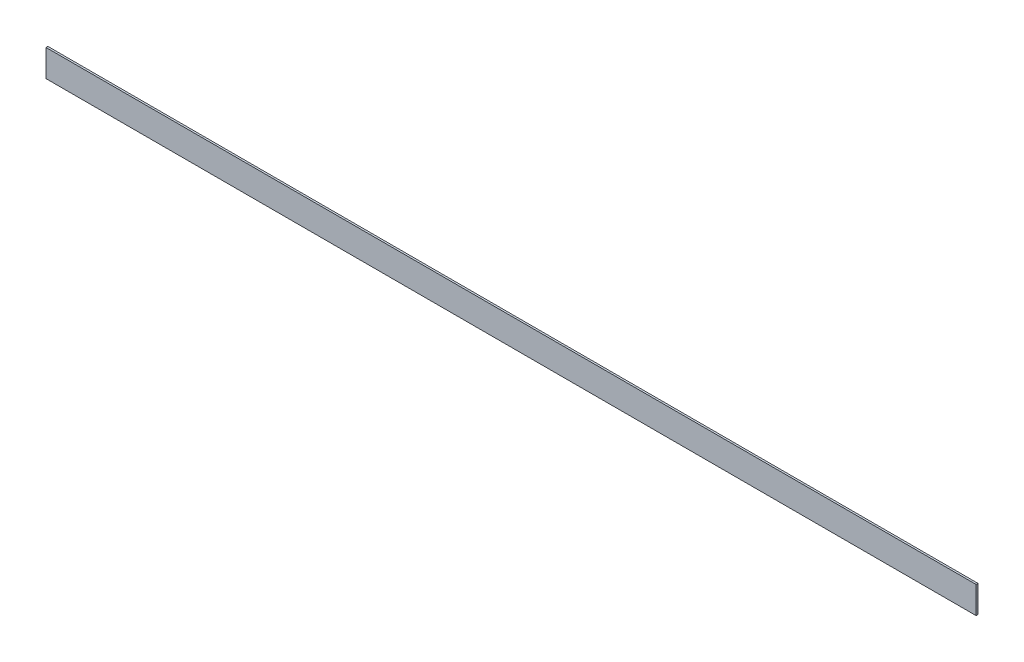
ISO-10303-21;
HEADER;
FILE_DESCRIPTION(('STEP AP214'),'2;1');
FILE_NAME('part.step','',(''),(''),'','','');
FILE_SCHEMA(('AUTOMOTIVE_DESIGN { 1 0 10303 214 1 1 1 1 }'));
ENDSEC;
DATA;
#1=APPLICATION_CONTEXT('core data for automotive mechanical design processes');
#2=APPLICATION_PROTOCOL_DEFINITION('international standard','automotive_design',2000,#1);
#3=PRODUCT_CONTEXT('',#1,'mechanical');
#4=PRODUCT('Part','Part','',(#3));
#5=PRODUCT_RELATED_PRODUCT_CATEGORY('part','',(#4));
#6=PRODUCT_DEFINITION_FORMATION('','',#4);
#7=PRODUCT_DEFINITION_CONTEXT('part definition',#1,'design');
#8=PRODUCT_DEFINITION('design','',#6,#7);
#9=PRODUCT_DEFINITION_SHAPE('','',#8);
#10=(LENGTH_UNIT() NAMED_UNIT(*) SI_UNIT(.MILLI.,.METRE.));
#11=(NAMED_UNIT(*) PLANE_ANGLE_UNIT() SI_UNIT($,.RADIAN.));
#12=(NAMED_UNIT(*) SI_UNIT($,.STERADIAN.) SOLID_ANGLE_UNIT());
#13=UNCERTAINTY_MEASURE_WITH_UNIT(LENGTH_MEASURE(1.E-05),#10,'distance_accuracy_value','');
#14=(GEOMETRIC_REPRESENTATION_CONTEXT(3) GLOBAL_UNCERTAINTY_ASSIGNED_CONTEXT((#13)) GLOBAL_UNIT_ASSIGNED_CONTEXT((#10,
#11,#12)) REPRESENTATION_CONTEXT('',''));
#15=CARTESIAN_POINT('',(0.,0.,0.));
#16=DIRECTION('',(0.,0.,1.));
#17=DIRECTION('',(1.,0.,0.));
#18=AXIS2_PLACEMENT_3D('',#15,#16,#17);
#19=CARTESIAN_POINT('',(-155.,9.,-0.314999999999981));
#20=DIRECTION('',(1.,0.,0.));
#21=DIRECTION('',(0.,0.,-1.));
#22=AXIS2_PLACEMENT_3D('',#19,#20,#21);
#23=PLANE('',#22);
#24=DIRECTION('',(0.,0.,1.));
#25=VECTOR('',#24,1.);
#26=CARTESIAN_POINT('',(-155.,0.,-0.314999999999981));
#27=LINE('',#26,#25);
#28=CARTESIAN_POINT('',(-155.,0.,-0.314999999999981));
#29=VERTEX_POINT('',#28);
#30=CARTESIAN_POINT('',(-155.,0.,0.315000000000019));
#31=VERTEX_POINT('',#30);
#32=EDGE_CURVE('E95',#29,#31,#27,.T.);
#33=ORIENTED_EDGE('',*,*,#32,.T.);
#34=DIRECTION('',(0.,-1.,0.));
#35=VECTOR('',#34,1.);
#36=CARTESIAN_POINT('',(-155.,9.,0.315000000000019));
#37=LINE('',#36,#35);
#38=CARTESIAN_POINT('',(-155.,9.,0.315000000000019));
#39=VERTEX_POINT('',#38);
#40=EDGE_CURVE('E11',#39,#31,#37,.T.);
#41=ORIENTED_EDGE('',*,*,#40,.F.);
#42=DIRECTION('',(0.,0.,1.));
#43=VECTOR('',#42,1.);
#44=CARTESIAN_POINT('',(-155.,9.,-0.314999999999981));
#45=LINE('',#44,#43);
#46=CARTESIAN_POINT('',(-155.,9.,-0.314999999999981));
#47=VERTEX_POINT('',#46);
#48=EDGE_CURVE('E83',#47,#39,#45,.T.);
#49=ORIENTED_EDGE('',*,*,#48,.F.);
#50=DIRECTION('',(0.,-1.,0.));
#51=VECTOR('',#50,1.);
#52=CARTESIAN_POINT('',(-155.,9.,-0.314999999999981));
#53=LINE('',#52,#51);
#54=EDGE_CURVE('E91',#47,#29,#53,.T.);
#55=ORIENTED_EDGE('',*,*,#54,.T.);
#56=EDGE_LOOP('',(#33,#41,#49,#55));
#57=FACE_BOUND('',#56,.T.);
#58=ADVANCED_FACE('F32',(#57),#23,.F.);
#59=CARTESIAN_POINT('',(155.,9.,0.314999999999981));
#60=DIRECTION('',(0.,0.,-1.));
#61=DIRECTION('',(-1.,0.,0.));
#62=AXIS2_PLACEMENT_3D('',#59,#60,#61);
#63=PLANE('',#62);
#64=DIRECTION('',(1.,0.,0.));
#65=VECTOR('',#64,1.);
#66=CARTESIAN_POINT('',(155.,0.,0.314999999999981));
#67=LINE('',#66,#65);
#68=CARTESIAN_POINT('',(155.,0.,0.314999999999981));
#69=VERTEX_POINT('',#68);
#70=EDGE_CURVE('E87',#31,#69,#67,.T.);
#71=ORIENTED_EDGE('',*,*,#70,.T.);
#72=DIRECTION('',(0.,-1.,0.));
#73=VECTOR('',#72,1.);
#74=CARTESIAN_POINT('',(155.,9.,0.314999999999981));
#75=LINE('',#74,#73);
#76=CARTESIAN_POINT('',(155.,9.,0.314999999999981));
#77=VERTEX_POINT('',#76);
#78=EDGE_CURVE('E40',#77,#69,#75,.T.);
#79=ORIENTED_EDGE('',*,*,#78,.F.);
#80=DIRECTION('',(1.,0.,0.));
#81=VECTOR('',#80,1.);
#82=CARTESIAN_POINT('',(155.,9.,0.314999999999981));
#83=LINE('',#82,#81);
#84=EDGE_CURVE('E78',#39,#77,#83,.T.);
#85=ORIENTED_EDGE('',*,*,#84,.F.);
#86=ORIENTED_EDGE('',*,*,#40,.T.);
#87=EDGE_LOOP('',(#71,#79,#85,#86));
#88=FACE_BOUND('',#87,.T.);
#89=ADVANCED_FACE('F86',(#88),#63,.F.);
#90=CARTESIAN_POINT('',(155.,9.,-0.315000000000019));
#91=DIRECTION('',(-1.,0.,0.));
#92=DIRECTION('',(0.,0.,1.));
#93=AXIS2_PLACEMENT_3D('',#90,#91,#92);
#94=PLANE('',#93);
#95=DIRECTION('',(0.,0.,-1.));
#96=VECTOR('',#95,1.);
#97=CARTESIAN_POINT('',(155.,0.,-0.315000000000019));
#98=LINE('',#97,#96);
#99=CARTESIAN_POINT('',(155.,0.,-0.315000000000019));
#100=VERTEX_POINT('',#99);
#101=EDGE_CURVE('E65',#69,#100,#98,.T.);
#102=ORIENTED_EDGE('',*,*,#101,.T.);
#103=DIRECTION('',(0.,-1.,0.));
#104=VECTOR('',#103,1.);
#105=CARTESIAN_POINT('',(155.,9.,-0.315000000000019));
#106=LINE('',#105,#104);
#107=CARTESIAN_POINT('',(155.,9.,-0.315000000000019));
#108=VERTEX_POINT('',#107);
#109=EDGE_CURVE('E88',#108,#100,#106,.T.);
#110=ORIENTED_EDGE('',*,*,#109,.F.);
#111=DIRECTION('',(0.,0.,-1.));
#112=VECTOR('',#111,1.);
#113=CARTESIAN_POINT('',(155.,9.,-0.315000000000019));
#114=LINE('',#113,#112);
#115=EDGE_CURVE('E81',#77,#108,#114,.T.);
#116=ORIENTED_EDGE('',*,*,#115,.F.);
#117=ORIENTED_EDGE('',*,*,#78,.T.);
#118=EDGE_LOOP('',(#102,#110,#116,#117));
#119=FACE_BOUND('',#118,.T.);
#120=ADVANCED_FACE('F89',(#119),#94,.F.);
#121=CARTESIAN_POINT('',(155.,9.,-0.315000000000019));
#122=DIRECTION('',(0.,0.,1.));
#123=DIRECTION('',(1.,0.,0.));
#124=AXIS2_PLACEMENT_3D('',#121,#122,#123);
#125=PLANE('',#124);
#126=DIRECTION('',(-1.,0.,0.));
#127=VECTOR('',#126,1.);
#128=CARTESIAN_POINT('',(155.,0.,-0.315000000000019));
#129=LINE('',#128,#127);
#130=EDGE_CURVE('E71',#100,#29,#129,.T.);
#131=ORIENTED_EDGE('',*,*,#130,.T.);
#132=ORIENTED_EDGE('',*,*,#54,.F.);
#133=DIRECTION('',(-1.,0.,0.));
#134=VECTOR('',#133,1.);
#135=CARTESIAN_POINT('',(155.,9.,-0.315000000000019));
#136=LINE('',#135,#134);
#137=EDGE_CURVE('E48',#108,#47,#136,.T.);
#138=ORIENTED_EDGE('',*,*,#137,.F.);
#139=ORIENTED_EDGE('',*,*,#109,.T.);
#140=EDGE_LOOP('',(#131,#132,#138,#139));
#141=FACE_BOUND('',#140,.T.);
#142=ADVANCED_FACE('F102',(#141),#125,.F.);
#143=CARTESIAN_POINT('',(0.,9.,0.));
#144=DIRECTION('',(0.,-1.,0.));
#145=DIRECTION('',(0.,0.,-1.));
#146=AXIS2_PLACEMENT_3D('',#143,#144,#145);
#147=PLANE('',#146);
#148=ORIENTED_EDGE('',*,*,#48,.T.);
#149=ORIENTED_EDGE('',*,*,#84,.T.);
#150=ORIENTED_EDGE('',*,*,#115,.T.);
#151=ORIENTED_EDGE('',*,*,#137,.T.);
#152=EDGE_LOOP('',(#148,#149,#150,#151));
#153=FACE_BOUND('',#152,.T.);
#154=ADVANCED_FACE('F79',(#153),#147,.F.);
#155=CARTESIAN_POINT('',(0.,0.,0.));
#156=DIRECTION('',(0.,-1.,0.));
#157=DIRECTION('',(0.,0.,-1.));
#158=AXIS2_PLACEMENT_3D('',#155,#156,#157);
#159=PLANE('',#158);
#160=ORIENTED_EDGE('',*,*,#32,.F.);
#161=ORIENTED_EDGE('',*,*,#130,.F.);
#162=ORIENTED_EDGE('',*,*,#101,.F.);
#163=ORIENTED_EDGE('',*,*,#70,.F.);
#164=EDGE_LOOP('',(#160,#161,#162,#163));
#165=FACE_BOUND('',#164,.T.);
#166=ADVANCED_FACE('F105',(#165),#159,.T.);
#167=CLOSED_SHELL('',(#58,#89,#120,#142,#154,#166));
#168=MANIFOLD_SOLID_BREP('B2',#167);
#169=ADVANCED_BREP_SHAPE_REPRESENTATION('',(#18,#168),#14);
#170=SHAPE_DEFINITION_REPRESENTATION(#9,#169);
ENDSEC;
END-ISO-10303-21;
